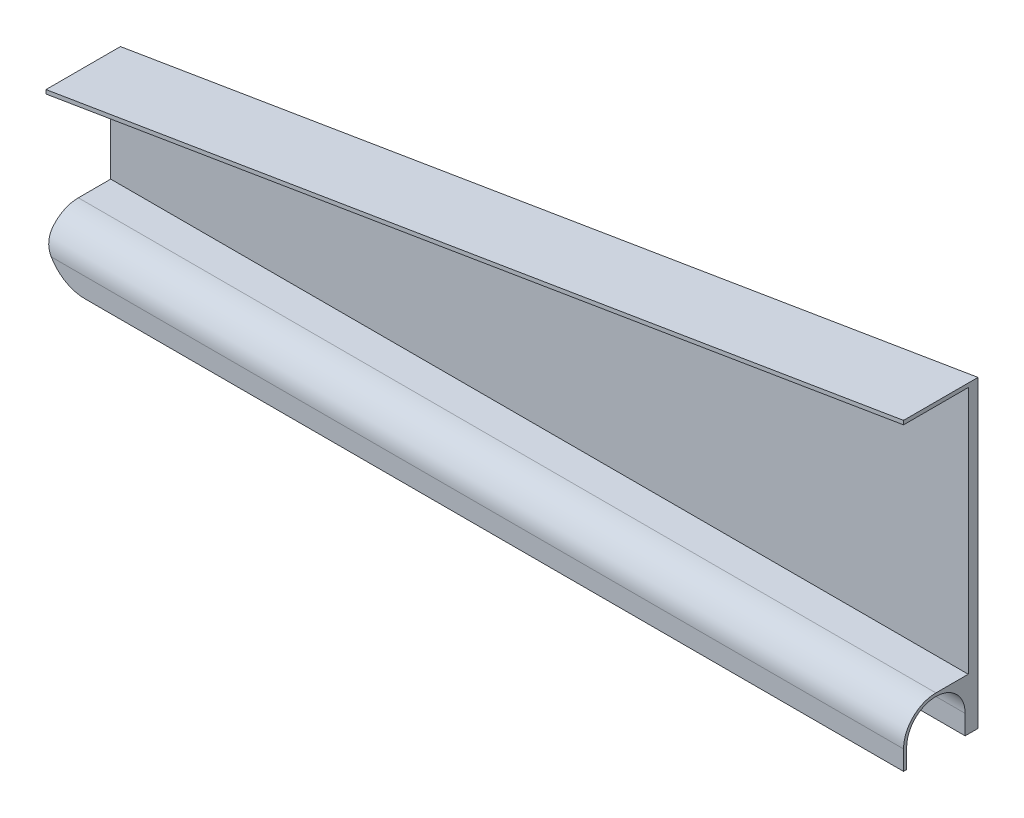
ISO-10303-21;
HEADER;
FILE_DESCRIPTION(('STEP AP214'),'2;1');
FILE_NAME('part.step','',(''),(''),'','','');
FILE_SCHEMA(('AUTOMOTIVE_DESIGN { 1 0 10303 214 1 1 1 1 }'));
ENDSEC;
DATA;
#1=APPLICATION_CONTEXT('core data for automotive mechanical design processes');
#2=APPLICATION_PROTOCOL_DEFINITION('international standard','automotive_design',2000,#1);
#3=PRODUCT_CONTEXT('',#1,'mechanical');
#4=PRODUCT('Part','Part','',(#3));
#5=PRODUCT_RELATED_PRODUCT_CATEGORY('part','',(#4));
#6=PRODUCT_DEFINITION_FORMATION('','',#4);
#7=PRODUCT_DEFINITION_CONTEXT('part definition',#1,'design');
#8=PRODUCT_DEFINITION('design','',#6,#7);
#9=PRODUCT_DEFINITION_SHAPE('','',#8);
#10=(LENGTH_UNIT() NAMED_UNIT(*) SI_UNIT(.MILLI.,.METRE.));
#11=(NAMED_UNIT(*) PLANE_ANGLE_UNIT() SI_UNIT($,.RADIAN.));
#12=(NAMED_UNIT(*) SI_UNIT($,.STERADIAN.) SOLID_ANGLE_UNIT());
#13=UNCERTAINTY_MEASURE_WITH_UNIT(LENGTH_MEASURE(1.E-05),#10,'distance_accuracy_value','');
#14=(GEOMETRIC_REPRESENTATION_CONTEXT(3) GLOBAL_UNCERTAINTY_ASSIGNED_CONTEXT((#13)) GLOBAL_UNIT_ASSIGNED_CONTEXT((#10,
#11,#12)) REPRESENTATION_CONTEXT('',''));
#15=CARTESIAN_POINT('',(0.,0.,0.));
#16=DIRECTION('',(0.,0.,1.));
#17=DIRECTION('',(1.,0.,0.));
#18=AXIS2_PLACEMENT_3D('',#15,#16,#17);
#19=CARTESIAN_POINT('',(-508.085110878234,0.,6.35));
#20=DIRECTION('',(-1.,0.,0.));
#21=DIRECTION('',(0.,0.,1.));
#22=AXIS2_PLACEMENT_3D('',#19,#20,#21);
#23=PLANE('',#22);
#24=DIRECTION('',(0.,0.,-1.));
#25=VECTOR('',#24,1.);
#26=CARTESIAN_POINT('',(-508.085110878234,-181.437945662038,6.35));
#27=LINE('',#26,#25);
#28=CARTESIAN_POINT('',(-508.085110878234,-181.437945662038,13.2329683428764));
#29=VERTEX_POINT('',#28);
#30=CARTESIAN_POINT('',(-508.085110878234,-181.437945662038,0.));
#31=VERTEX_POINT('',#30);
#32=EDGE_CURVE('E48',#29,#31,#27,.T.);
#33=ORIENTED_EDGE('',*,*,#32,.F.);
#34=CARTESIAN_POINT('',(-508.085110878234,-194.137945662038,27.432));
#35=DIRECTION('',(-1.,0.,0.));
#36=DIRECTION('',(0.,0.,1.));
#37=AXIS2_PLACEMENT_3D('',#34,#35,#36);
#38=CIRCLE('',#37,19.05);
#39=CARTESIAN_POINT('',(-508.085110878234,-181.437945662038,41.6310316571236));
#40=VERTEX_POINT('',#39);
#41=EDGE_CURVE('E157',#40,#29,#38,.T.);
#42=ORIENTED_EDGE('',*,*,#41,.F.);
#43=DIRECTION('',(0.,0.,-1.));
#44=VECTOR('',#43,1.);
#45=CARTESIAN_POINT('',(-508.085110878234,-181.437945662038,116.84));
#46=LINE('',#45,#44);
#47=CARTESIAN_POINT('',(-508.085110878234,-181.437945662038,44.2593801882527));
#48=VERTEX_POINT('',#47);
#49=EDGE_CURVE('E146',#48,#40,#46,.T.);
#50=ORIENTED_EDGE('',*,*,#49,.F.);
#51=CARTESIAN_POINT('',(-508.085110878234,-194.137945662038,27.432));
#52=DIRECTION('',(-1.,0.,0.));
#53=DIRECTION('',(0.,0.,1.));
#54=AXIS2_PLACEMENT_3D('',#51,#52,#53);
#55=CIRCLE('',#54,21.082);
#56=CARTESIAN_POINT('',(-508.085110878234,-173.055945662038,27.432));
#57=VERTEX_POINT('',#56);
#58=EDGE_CURVE('E154',#48,#57,#55,.T.);
#59=ORIENTED_EDGE('',*,*,#58,.T.);
#60=DIRECTION('',(0.,0.,1.));
#61=VECTOR('',#60,1.);
#62=CARTESIAN_POINT('',(-508.085110878234,-173.055945662038,0.));
#63=LINE('',#62,#61);
#64=CARTESIAN_POINT('',(-508.085110878234,-173.055945662038,6.35));
#65=VERTEX_POINT('',#64);
#66=EDGE_CURVE('E175',#65,#57,#63,.T.);
#67=ORIENTED_EDGE('',*,*,#66,.F.);
#68=DIRECTION('',(0.,1.,0.));
#69=VECTOR('',#68,1.);
#70=CARTESIAN_POINT('',(-508.085110878234,0.,6.35));
#71=LINE('',#70,#69);
#72=CARTESIAN_POINT('',(-508.085110878234,-103.967945662038,6.35));
#73=VERTEX_POINT('',#72);
#74=EDGE_CURVE('E196',#65,#73,#71,.T.);
#75=ORIENTED_EDGE('',*,*,#74,.T.);
#76=DIRECTION('',(0.,0.,-1.));
#77=VECTOR('',#76,1.);
#78=CARTESIAN_POINT('',(-508.085110878234,-103.967945662038,48.514));
#79=LINE('',#78,#77);
#80=CARTESIAN_POINT('',(-508.085110878234,-103.967945662038,48.514));
#81=VERTEX_POINT('',#80);
#82=EDGE_CURVE('E261',#81,#73,#79,.T.);
#83=ORIENTED_EDGE('',*,*,#82,.F.);
#84=DIRECTION('',(0.,-1.,0.));
#85=VECTOR('',#84,1.);
#86=CARTESIAN_POINT('',(-508.085110878234,-101.427945662038,48.514));
#87=LINE('',#86,#85);
#88=CARTESIAN_POINT('',(-508.085110878234,-101.427945662038,48.514));
#89=VERTEX_POINT('',#88);
#90=EDGE_CURVE('E237',#89,#81,#87,.T.);
#91=ORIENTED_EDGE('',*,*,#90,.F.);
#92=DIRECTION('',(0.,0.,1.));
#93=VECTOR('',#92,1.);
#94=CARTESIAN_POINT('',(-508.085110878234,-101.427945662038,0.));
#95=LINE('',#94,#93);
#96=CARTESIAN_POINT('',(-508.085110878234,-101.427945662038,0.));
#97=VERTEX_POINT('',#96);
#98=EDGE_CURVE('E220',#97,#89,#95,.T.);
#99=ORIENTED_EDGE('',*,*,#98,.F.);
#100=DIRECTION('',(0.,1.,0.));
#101=VECTOR('',#100,1.);
#102=CARTESIAN_POINT('',(-508.085110878234,0.,0.));
#103=LINE('',#102,#101);
#104=EDGE_CURVE('E164',#31,#97,#103,.T.);
#105=ORIENTED_EDGE('',*,*,#104,.F.);
#106=EDGE_LOOP('',(#33,#42,#50,#59,#67,#75,#83,#91,#99,#105));
#107=FACE_BOUND('',#106,.T.);
#108=ADVANCED_FACE('F35',(#107),#23,.T.);
#109=CARTESIAN_POINT('',(0.,-206.837945662038,6.35));
#110=DIRECTION('',(0.,1.,0.));
#111=DIRECTION('',(-1.,0.,0.));
#112=AXIS2_PLACEMENT_3D('',#109,#110,#111);
#113=PLANE('',#112);
#114=DIRECTION('',(1.,0.,0.));
#115=VECTOR('',#114,1.);
#116=CARTESIAN_POINT('',(-562.11312601853,-206.837945662038,8.38199999999999));
#117=LINE('',#116,#115);
#118=CARTESIAN_POINT('',(-482.685110878234,-206.837945662038,8.38199999999999));
#119=VERTEX_POINT('',#118);
#120=CARTESIAN_POINT('',(50.7148891217656,-206.837945662038,8.38199999999999));
#121=VERTEX_POINT('',#120);
#122=EDGE_CURVE('E180',#119,#121,#117,.T.);
#123=ORIENTED_EDGE('',*,*,#122,.F.);
#124=DIRECTION('',(0.,0.,-1.));
#125=VECTOR('',#124,1.);
#126=CARTESIAN_POINT('',(-482.685110878234,-206.837945662038,6.35));
#127=LINE('',#126,#125);
#128=CARTESIAN_POINT('',(-482.685110878234,-206.837945662038,0.));
#129=VERTEX_POINT('',#128);
#130=EDGE_CURVE('E213',#119,#129,#127,.T.);
#131=ORIENTED_EDGE('',*,*,#130,.T.);
#132=DIRECTION('',(1.,0.,0.));
#133=VECTOR('',#132,1.);
#134=CARTESIAN_POINT('',(0.,-206.837945662038,0.));
#135=LINE('',#134,#133);
#136=CARTESIAN_POINT('',(50.7148891217656,-206.837945662038,0.));
#137=VERTEX_POINT('',#136);
#138=EDGE_CURVE('E205',#129,#137,#135,.T.);
#139=ORIENTED_EDGE('',*,*,#138,.T.);
#140=DIRECTION('',(0.,0.,-1.));
#141=VECTOR('',#140,1.);
#142=CARTESIAN_POINT('',(50.7148891217656,-206.837945662038,6.35));
#143=LINE('',#142,#141);
#144=EDGE_CURVE('E211',#121,#137,#143,.T.);
#145=ORIENTED_EDGE('',*,*,#144,.F.);
#146=EDGE_LOOP('',(#123,#131,#139,#145));
#147=FACE_BOUND('',#146,.T.);
#148=ADVANCED_FACE('F229',(#147),#113,.F.);
#149=CARTESIAN_POINT('',(0.,0.,6.35));
#150=DIRECTION('',(0.,0.,1.));
#151=DIRECTION('',(1.,0.,0.));
#152=AXIS2_PLACEMENT_3D('',#149,#150,#151);
#153=PLANE('',#152);
#154=DIRECTION('',(0.,-1.,0.));
#155=VECTOR('',#154,1.);
#156=CARTESIAN_POINT('',(50.7148891217656,0.,6.35));
#157=LINE('',#156,#155);
#158=CARTESIAN_POINT('',(50.7148891217656,-11.2579456620378,6.35));
#159=VERTEX_POINT('',#158);
#160=CARTESIAN_POINT('',(50.7148891217656,-173.055945662038,6.35));
#161=VERTEX_POINT('',#160);
#162=EDGE_CURVE('E199',#159,#161,#157,.T.);
#163=ORIENTED_EDGE('',*,*,#162,.F.);
#164=DIRECTION('',(0.986514849274291,0.163671781811416,0.));
#165=VECTOR('',#164,1.);
#166=CARTESIAN_POINT('',(-508.085110878234,-103.967945662038,6.35));
#167=LINE('',#166,#165);
#168=EDGE_CURVE('E235',#73,#159,#167,.T.);
#169=ORIENTED_EDGE('',*,*,#168,.F.);
#170=ORIENTED_EDGE('',*,*,#74,.F.);
#171=DIRECTION('',(1.,0.,0.));
#172=VECTOR('',#171,1.);
#173=CARTESIAN_POINT('',(-562.11312601853,-173.055945662038,6.35));
#174=LINE('',#173,#172);
#175=EDGE_CURVE('E177',#65,#161,#174,.T.);
#176=ORIENTED_EDGE('',*,*,#175,.T.);
#177=EDGE_LOOP('',(#163,#169,#170,#176));
#178=FACE_BOUND('',#177,.T.);
#179=ADVANCED_FACE('F328',(#178),#153,.T.);
#180=CARTESIAN_POINT('',(-482.685110878234,-181.437945662038,6.35));
#181=DIRECTION('',(0.,0.,-1.));
#182=DIRECTION('',(-1.,0.,0.));
#183=AXIS2_PLACEMENT_3D('',#180,#181,#182);
#184=CYLINDRICAL_SURFACE('',#183,25.4);
#185=CARTESIAN_POINT('',(-482.685110878234,-181.437945662038,0.));
#186=DIRECTION('',(0.,0.,1.));
#187=DIRECTION('',(1.,0.,0.));
#188=AXIS2_PLACEMENT_3D('',#185,#186,#187);
#189=CIRCLE('',#188,25.4);
#190=EDGE_CURVE('E168',#129,#31,#189,.F.);
#191=ORIENTED_EDGE('',*,*,#190,.F.);
#192=ORIENTED_EDGE('',*,*,#130,.F.);
#193=CARTESIAN_POINT('',(-482.685110878234,-181.437945662038,8.38199999999997));
#194=DIRECTION('',(0.,0.,-1.));
#195=DIRECTION('',(0.,1.,0.));
#196=AXIS2_PLACEMENT_3D('',#193,#194,#195);
#197=CIRCLE('',#196,25.4);
#198=CARTESIAN_POINT('',(-504.682156134359,-194.137945662038,8.38199999999999));
#199=VERTEX_POINT('',#198);
#200=EDGE_CURVE('E55',#199,#119,#197,.F.);
#201=ORIENTED_EDGE('',*,*,#200,.F.);
#202=CARTESIAN_POINT('',(-504.682156134359,-194.137945662038,8.38199999999999));
#203=CARTESIAN_POINT('',(-504.79720975601,-193.938670363744,8.38199960905063));
#204=CARTESIAN_POINT('',(-504.909542266543,-193.737845939561,8.38512760889851));
#205=CARTESIAN_POINT('',(-505.128637186274,-193.333366321374,8.39792245076879));
#206=CARTESIAN_POINT('',(-505.235399127924,-193.129710891571,8.40758984070479));
#207=CARTESIAN_POINT('',(-505.54716362878,-192.514842149194,8.44683038355515));
#208=CARTESIAN_POINT('',(-505.743584211063,-192.099831482841,8.48664220709793));
#209=CARTESIAN_POINT('',(-506.112042738039,-191.263790426877,8.59535665893664));
#210=CARTESIAN_POINT('',(-506.284124434883,-190.842772376236,8.66420617751531));
#211=CARTESIAN_POINT('',(-506.603660878553,-189.997560315258,8.83239535956349));
#212=CARTESIAN_POINT('',(-506.751120951007,-189.573367012519,8.93172841625499));
#213=CARTESIAN_POINT('',(-507.021774223212,-188.723977190887,9.16219407467895));
#214=CARTESIAN_POINT('',(-507.144873455938,-188.29878295229,9.29344561996288));
#215=CARTESIAN_POINT('',(-507.366489919966,-187.452985054512,9.58783164899344));
#216=CARTESIAN_POINT('',(-507.465003849174,-187.03238201923,9.75097041032528));
#217=CARTESIAN_POINT('',(-507.638319030903,-186.200084642028,10.1086673678386));
#218=CARTESIAN_POINT('',(-507.713136225676,-185.788384485069,10.3032043069566));
#219=CARTESIAN_POINT('',(-507.840627117345,-184.977510247968,10.7227990128837));
#220=CARTESIAN_POINT('',(-507.893306564792,-184.578332939824,10.9478488334835));
#221=CARTESIAN_POINT('',(-507.988863951516,-183.700528957711,11.4855929629348));
#222=CARTESIAN_POINT('',(-508.026251273516,-183.226161227395,11.8062970308383));
#223=CARTESIAN_POINT('',(-508.062339033711,-182.537588191789,12.318557161645));
#224=CARTESIAN_POINT('',(-508.071036658041,-182.311989671166,12.4944253237479));
#225=CARTESIAN_POINT('',(-508.082422361592,-181.868820448773,12.8562376613549));
#226=CARTESIAN_POINT('',(-508.085109770817,-181.651250644672,13.0421829578547));
#227=CARTESIAN_POINT('',(-508.085110878234,-181.437945662038,13.2329683428764));
#228=B_SPLINE_CURVE_WITH_KNOTS('',3,(#202,#203,#204,#205,#206,#207,#208,#209,#210,#211,#212,
#213,#214,#215,#216,#217,#218,#219,#220,#221,#222,#223,#224,#225,#226,#227),.UNSPECIFIED.,.F.,
.F.,(4,2,2,2,2,2,2,2,2,2,2,2,4),(0.,0.690227917147268,1.38051367334319,2.76144818206338,
4.13986785108374,5.51798898229213,6.90132653906519,8.28484979441021,9.66744028159059,
11.0496714016422,12.7677137040457,13.6259651289362,14.4843122237777),.UNSPECIFIED.);
#229=EDGE_CURVE('E217',#199,#29,#228,.T.);
#230=ORIENTED_EDGE('',*,*,#229,.T.);
#231=ORIENTED_EDGE('',*,*,#32,.T.);
#232=EDGE_LOOP('',(#191,#192,#201,#230,#231));
#233=FACE_BOUND('',#232,.T.);
#234=ADVANCED_FACE('F216',(#233),#184,.T.);
#235=CARTESIAN_POINT('',(50.7148891217656,0.,6.35));
#236=DIRECTION('',(1.,0.,0.));
#237=DIRECTION('',(0.,1.,0.));
#238=AXIS2_PLACEMENT_3D('',#235,#236,#237);
#239=PLANE('',#238);
#240=DIRECTION('',(0.,-1.,0.));
#241=VECTOR('',#240,1.);
#242=CARTESIAN_POINT('',(50.7148891217656,0.,0.));
#243=LINE('',#242,#241);
#244=CARTESIAN_POINT('',(50.7148891217656,-8.71794566203782,0.));
#245=VERTEX_POINT('',#244);
#246=EDGE_CURVE('E200',#245,#137,#243,.T.);
#247=ORIENTED_EDGE('',*,*,#246,.F.);
#248=DIRECTION('',(0.,0.,-1.));
#249=VECTOR('',#248,1.);
#250=CARTESIAN_POINT('',(50.7148891217656,-8.71794566203782,6.35));
#251=LINE('',#250,#249);
#252=CARTESIAN_POINT('',(50.7148891217656,-8.71794566203782,48.514));
#253=VERTEX_POINT('',#252);
#254=EDGE_CURVE('E201',#253,#245,#251,.T.);
#255=ORIENTED_EDGE('',*,*,#254,.F.);
#256=DIRECTION('',(0.,1.,0.));
#257=VECTOR('',#256,1.);
#258=CARTESIAN_POINT('',(50.7148891217656,-8.71794566203782,48.514));
#259=LINE('',#258,#257);
#260=CARTESIAN_POINT('',(50.7148891217656,-11.2579456620378,48.514));
#261=VERTEX_POINT('',#260);
#262=EDGE_CURVE('E252',#261,#253,#259,.T.);
#263=ORIENTED_EDGE('',*,*,#262,.F.);
#264=DIRECTION('',(0.,0.,-1.));
#265=VECTOR('',#264,1.);
#266=CARTESIAN_POINT('',(50.7148891217656,-11.2579456620378,48.514));
#267=LINE('',#266,#265);
#268=EDGE_CURVE('E257',#261,#159,#267,.T.);
#269=ORIENTED_EDGE('',*,*,#268,.T.);
#270=ORIENTED_EDGE('',*,*,#162,.T.);
#271=DIRECTION('',(0.,0.,1.));
#272=VECTOR('',#271,1.);
#273=CARTESIAN_POINT('',(50.7148891217656,-173.055945662038,0.));
#274=LINE('',#273,#272);
#275=CARTESIAN_POINT('',(50.7148891217656,-173.055945662038,27.432));
#276=VERTEX_POINT('',#275);
#277=EDGE_CURVE('E272',#161,#276,#274,.T.);
#278=ORIENTED_EDGE('',*,*,#277,.T.);
#279=CARTESIAN_POINT('',(50.7148891217656,-194.137945662038,27.432));
#280=DIRECTION('',(1.,0.,0.));
#281=DIRECTION('',(0.,0.,-1.));
#282=AXIS2_PLACEMENT_3D('',#279,#280,#281);
#283=CIRCLE('',#282,21.082);
#284=CARTESIAN_POINT('',(50.7148891217656,-194.137945662038,48.514));
#285=VERTEX_POINT('',#284);
#286=EDGE_CURVE('E194',#285,#276,#283,.F.);
#287=ORIENTED_EDGE('',*,*,#286,.F.);
#288=DIRECTION('',(0.,1.,0.));
#289=VECTOR('',#288,1.);
#290=CARTESIAN_POINT('',(50.7148891217656,0.,48.514));
#291=LINE('',#290,#289);
#292=CARTESIAN_POINT('',(50.7148891217656,-206.837945662038,48.514));
#293=VERTEX_POINT('',#292);
#294=EDGE_CURVE('E191',#293,#285,#291,.T.);
#295=ORIENTED_EDGE('',*,*,#294,.F.);
#296=DIRECTION('',(0.,0.,-1.));
#297=VECTOR('',#296,1.);
#298=CARTESIAN_POINT('',(50.7148891217656,-206.837945662038,0.));
#299=LINE('',#298,#297);
#300=CARTESIAN_POINT('',(50.7148891217656,-206.837945662038,46.482));
#301=VERTEX_POINT('',#300);
#302=EDGE_CURVE('E269',#293,#301,#299,.T.);
#303=ORIENTED_EDGE('',*,*,#302,.T.);
#304=DIRECTION('',(0.,1.,0.));
#305=VECTOR('',#304,1.);
#306=CARTESIAN_POINT('',(50.7148891217656,0.,46.4820000000001));
#307=LINE('',#306,#305);
#308=CARTESIAN_POINT('',(50.7148891217656,-194.137945662038,46.482));
#309=VERTEX_POINT('',#308);
#310=EDGE_CURVE('E171',#301,#309,#307,.T.);
#311=ORIENTED_EDGE('',*,*,#310,.T.);
#312=CARTESIAN_POINT('',(50.7148891217656,-194.137945662038,27.432));
#313=DIRECTION('',(1.,0.,0.));
#314=DIRECTION('',(0.,0.,-1.));
#315=AXIS2_PLACEMENT_3D('',#312,#313,#314);
#316=CIRCLE('',#315,19.05);
#317=CARTESIAN_POINT('',(50.7148891217656,-194.137945662038,8.38199999999999));
#318=VERTEX_POINT('',#317);
#319=EDGE_CURVE('E165',#309,#318,#316,.F.);
#320=ORIENTED_EDGE('',*,*,#319,.T.);
#321=DIRECTION('',(0.,1.,0.));
#322=VECTOR('',#321,1.);
#323=CARTESIAN_POINT('',(50.7148891217656,0.,8.38199999999988));
#324=LINE('',#323,#322);
#325=EDGE_CURVE('E182',#121,#318,#324,.T.);
#326=ORIENTED_EDGE('',*,*,#325,.F.);
#327=ORIENTED_EDGE('',*,*,#144,.T.);
#328=EDGE_LOOP('',(#247,#255,#263,#269,#270,#278,#287,#295,#303,#311,#320,#326,#327));
#329=FACE_BOUND('',#328,.T.);
#330=ADVANCED_FACE('F336',(#329),#239,.T.);
#331=CARTESIAN_POINT('',(0.,0.,0.));
#332=DIRECTION('',(0.,0.,1.));
#333=DIRECTION('',(1.,0.,0.));
#334=AXIS2_PLACEMENT_3D('',#331,#332,#333);
#335=PLANE('',#334);
#336=ORIENTED_EDGE('',*,*,#104,.T.);
#337=DIRECTION('',(0.986514849274291,0.163671781811416,0.));
#338=VECTOR('',#337,1.);
#339=CARTESIAN_POINT('',(-508.085110878234,-101.427945662038,0.));
#340=LINE('',#339,#338);
#341=EDGE_CURVE('E263',#97,#245,#340,.T.);
#342=ORIENTED_EDGE('',*,*,#341,.T.);
#343=ORIENTED_EDGE('',*,*,#246,.T.);
#344=ORIENTED_EDGE('',*,*,#138,.F.);
#345=ORIENTED_EDGE('',*,*,#190,.T.);
#346=EDGE_LOOP('',(#336,#342,#343,#344,#345));
#347=FACE_BOUND('',#346,.T.);
#348=ADVANCED_FACE('F224',(#347),#335,.F.);
#349=CARTESIAN_POINT('',(-562.11312601853,-173.055945662038,0.));
#350=DIRECTION('',(0.,1.,0.));
#351=DIRECTION('',(0.,0.,1.));
#352=AXIS2_PLACEMENT_3D('',#349,#350,#351);
#353=PLANE('',#352);
#354=ORIENTED_EDGE('',*,*,#175,.F.);
#355=ORIENTED_EDGE('',*,*,#66,.T.);
#356=DIRECTION('',(1.,0.,0.));
#357=VECTOR('',#356,1.);
#358=CARTESIAN_POINT('',(-562.11312601853,-173.055945662038,27.432));
#359=LINE('',#358,#357);
#360=EDGE_CURVE('E162',#57,#276,#359,.T.);
#361=ORIENTED_EDGE('',*,*,#360,.T.);
#362=ORIENTED_EDGE('',*,*,#277,.F.);
#363=EDGE_LOOP('',(#354,#355,#361,#362));
#364=FACE_BOUND('',#363,.T.);
#365=ADVANCED_FACE('F346',(#364),#353,.T.);
#366=CARTESIAN_POINT('',(-562.11312601853,0.,8.38199999999988));
#367=DIRECTION('',(0.,0.,-1.));
#368=DIRECTION('',(0.,1.,0.));
#369=AXIS2_PLACEMENT_3D('',#366,#367,#368);
#370=PLANE('',#369);
#371=DIRECTION('',(1.,0.,0.));
#372=VECTOR('',#371,1.);
#373=CARTESIAN_POINT('',(-562.11312601853,-194.137945662038,8.38199999999999));
#374=LINE('',#373,#372);
#375=EDGE_CURVE('E183',#199,#318,#374,.T.);
#376=ORIENTED_EDGE('',*,*,#375,.F.);
#377=ORIENTED_EDGE('',*,*,#200,.T.);
#378=ORIENTED_EDGE('',*,*,#122,.T.);
#379=ORIENTED_EDGE('',*,*,#325,.T.);
#380=EDGE_LOOP('',(#376,#377,#378,#379));
#381=FACE_BOUND('',#380,.T.);
#382=ADVANCED_FACE('F233',(#381),#370,.F.);
#383=CARTESIAN_POINT('',(-562.11312601853,-194.137945662038,27.432));
#384=DIRECTION('',(1.,0.,0.));
#385=DIRECTION('',(0.,0.,-1.));
#386=AXIS2_PLACEMENT_3D('',#383,#384,#385);
#387=CYLINDRICAL_SURFACE('',#386,19.05);
#388=ORIENTED_EDGE('',*,*,#229,.F.);
#389=ORIENTED_EDGE('',*,*,#375,.T.);
#390=ORIENTED_EDGE('',*,*,#319,.F.);
#391=DIRECTION('',(1.,0.,0.));
#392=VECTOR('',#391,1.);
#393=CARTESIAN_POINT('',(-562.11312601853,-194.137945662038,46.482));
#394=LINE('',#393,#392);
#395=CARTESIAN_POINT('',(-504.682156134359,-194.137945662038,46.482));
#396=VERTEX_POINT('',#395);
#397=EDGE_CURVE('E185',#396,#309,#394,.T.);
#398=ORIENTED_EDGE('',*,*,#397,.F.);
#399=CARTESIAN_POINT('',(-508.085110878234,-181.437945662038,41.6310316571236));
#400=CARTESIAN_POINT('',(-508.085110853028,-181.60945252099,41.7844328099501));
#401=CARTESIAN_POINT('',(-508.083373348191,-181.783723997483,41.9347107388957));
#402=CARTESIAN_POINT('',(-508.076090964915,-182.137557457659,42.2288281334745));
#403=CARTESIAN_POINT('',(-508.070545855066,-182.317119762261,42.3726672072151));
#404=CARTESIAN_POINT('',(-508.047697829708,-182.863422146816,42.7942640423852));
#405=CARTESIAN_POINT('',(-508.024181965592,-183.237712354122,43.0620429883658));
#406=CARTESIAN_POINT('',(-507.958184168992,-184.002905967128,43.5687209328664));
#407=CARTESIAN_POINT('',(-507.915731173468,-184.393783205462,43.8076632901387));
#408=CARTESIAN_POINT('',(-507.809738556414,-185.189492229823,44.2556757282683));
#409=CARTESIAN_POINT('',(-507.746202856225,-185.594321408278,44.4647513539433));
#410=CARTESIAN_POINT('',(-507.596050115694,-186.415906139081,44.8526691516433));
#411=CARTESIAN_POINT('',(-507.509350866137,-186.832699355812,45.0313998580509));
#412=CARTESIAN_POINT('',(-507.31174018432,-187.67296092858,45.3571091057461));
#413=CARTESIAN_POINT('',(-507.200825966186,-188.096430047457,45.5040839897298));
#414=CARTESIAN_POINT('',(-506.954221881208,-188.945644371535,45.7661154534158));
#415=CARTESIAN_POINT('',(-506.818551018047,-189.371387589415,45.8811963460616));
#416=CARTESIAN_POINT('',(-506.522369820378,-190.221322496853,46.0801399942699));
#417=CARTESIAN_POINT('',(-506.361865963714,-190.645514561583,46.16401087179));
#418=CARTESIAN_POINT('',(-505.97435007336,-191.591354382813,46.3184801878725));
#419=CARTESIAN_POINT('',(-505.740653370124,-192.111643085528,46.3809045766854));
#420=CARTESIAN_POINT('',(-505.36334297739,-192.880826831807,46.4422190001803));
#421=CARTESIAN_POINT('',(-505.233166744518,-193.135251560675,46.4572705288326));
#422=CARTESIAN_POINT('',(-504.964118338946,-193.639894845376,46.4771611036847));
#423=CARTESIAN_POINT('',(-504.825245525546,-193.890113089577,46.4819993965328));
#424=CARTESIAN_POINT('',(-504.682156134359,-194.137945662038,46.482));
#425=B_SPLINE_CURVE_WITH_KNOTS('',3,(#399,#400,#401,#402,#403,#404,#405,#406,#407,#408,#409,
#410,#411,#412,#413,#414,#415,#416,#417,#418,#419,#420,#421,#422,#423,#424),.UNSPECIFIED.,.F.,
.F.,(4,2,2,2,2,2,2,2,2,2,2,2,4),(0.,0.69021297965438,1.38046791125707,2.7612399817614,
4.13990934730637,5.5183224265845,6.90169412584389,8.28522506257534,9.66769840772432,
11.0498117320456,12.7676853661981,13.6259672320179,14.4843124044433),.UNSPECIFIED.);
#426=EDGE_CURVE('E239',#40,#396,#425,.T.);
#427=ORIENTED_EDGE('',*,*,#426,.F.);
#428=ORIENTED_EDGE('',*,*,#41,.T.);
#429=EDGE_LOOP('',(#388,#389,#390,#398,#427,#428));
#430=FACE_BOUND('',#429,.T.);
#431=ADVANCED_FACE('F278',(#430),#387,.F.);
#432=CARTESIAN_POINT('',(-562.11312601853,0.,46.4820000000001));
#433=DIRECTION('',(0.,0.,-1.));
#434=DIRECTION('',(0.,1.,0.));
#435=AXIS2_PLACEMENT_3D('',#432,#433,#434);
#436=PLANE('',#435);
#437=CARTESIAN_POINT('',(-482.685110878234,-181.437945662038,46.482));
#438=DIRECTION('',(0.,0.,-1.));
#439=DIRECTION('',(0.,1.,0.));
#440=AXIS2_PLACEMENT_3D('',#437,#438,#439);
#441=CIRCLE('',#440,25.4);
#442=CARTESIAN_POINT('',(-482.685110878234,-206.837945662038,46.482));
#443=VERTEX_POINT('',#442);
#444=EDGE_CURVE('E282',#396,#443,#441,.F.);
#445=ORIENTED_EDGE('',*,*,#444,.F.);
#446=ORIENTED_EDGE('',*,*,#397,.T.);
#447=ORIENTED_EDGE('',*,*,#310,.F.);
#448=DIRECTION('',(1.,0.,0.));
#449=VECTOR('',#448,1.);
#450=CARTESIAN_POINT('',(-562.11312601853,-206.837945662038,46.482));
#451=LINE('',#450,#449);
#452=EDGE_CURVE('E187',#443,#301,#451,.T.);
#453=ORIENTED_EDGE('',*,*,#452,.F.);
#454=EDGE_LOOP('',(#445,#446,#447,#453));
#455=FACE_BOUND('',#454,.T.);
#456=ADVANCED_FACE('F317',(#455),#436,.T.);
#457=CARTESIAN_POINT('',(-562.11312601853,-206.837945662038,0.));
#458=DIRECTION('',(0.,-1.,0.));
#459=DIRECTION('',(0.,0.,-1.));
#460=AXIS2_PLACEMENT_3D('',#457,#458,#459);
#461=PLANE('',#460);
#462=DIRECTION('',(0.,0.,-1.));
#463=VECTOR('',#462,1.);
#464=CARTESIAN_POINT('',(-482.685110878234,-206.837945662038,116.84));
#465=LINE('',#464,#463);
#466=CARTESIAN_POINT('',(-482.685110878234,-206.837945662038,48.514));
#467=VERTEX_POINT('',#466);
#468=EDGE_CURVE('E158',#467,#443,#465,.T.);
#469=ORIENTED_EDGE('',*,*,#468,.T.);
#470=ORIENTED_EDGE('',*,*,#452,.T.);
#471=ORIENTED_EDGE('',*,*,#302,.F.);
#472=DIRECTION('',(1.,0.,0.));
#473=VECTOR('',#472,1.);
#474=CARTESIAN_POINT('',(-562.11312601853,-206.837945662038,48.514));
#475=LINE('',#474,#473);
#476=EDGE_CURVE('E189',#467,#293,#475,.T.);
#477=ORIENTED_EDGE('',*,*,#476,.F.);
#478=EDGE_LOOP('',(#469,#470,#471,#477));
#479=FACE_BOUND('',#478,.T.);
#480=ADVANCED_FACE('F314',(#479),#461,.T.);
#481=CARTESIAN_POINT('',(-562.11312601853,0.,48.514));
#482=DIRECTION('',(0.,0.,-1.));
#483=DIRECTION('',(-1.,0.,0.));
#484=AXIS2_PLACEMENT_3D('',#481,#482,#483);
#485=PLANE('',#484);
#486=DIRECTION('',(1.,0.,0.));
#487=VECTOR('',#486,1.);
#488=CARTESIAN_POINT('',(-562.11312601853,-194.137945662038,48.514));
#489=LINE('',#488,#487);
#490=CARTESIAN_POINT('',(-504.682156134359,-194.137945662038,48.514));
#491=VERTEX_POINT('',#490);
#492=EDGE_CURVE('E192',#491,#285,#489,.T.);
#493=ORIENTED_EDGE('',*,*,#492,.F.);
#494=CARTESIAN_POINT('',(-482.685110878234,-181.437945662038,48.514));
#495=DIRECTION('',(0.,0.,-1.));
#496=DIRECTION('',(-1.,0.,0.));
#497=AXIS2_PLACEMENT_3D('',#494,#495,#496);
#498=CIRCLE('',#497,25.4);
#499=EDGE_CURVE('E63',#491,#467,#498,.F.);
#500=ORIENTED_EDGE('',*,*,#499,.T.);
#501=ORIENTED_EDGE('',*,*,#476,.T.);
#502=ORIENTED_EDGE('',*,*,#294,.T.);
#503=EDGE_LOOP('',(#493,#500,#501,#502));
#504=FACE_BOUND('',#503,.T.);
#505=ADVANCED_FACE('F311',(#504),#485,.F.);
#506=CARTESIAN_POINT('',(-562.11312601853,-194.137945662038,27.432));
#507=DIRECTION('',(1.,0.,0.));
#508=DIRECTION('',(0.,0.,-1.));
#509=AXIS2_PLACEMENT_3D('',#506,#507,#508);
#510=CYLINDRICAL_SURFACE('',#509,21.082);
#511=ORIENTED_EDGE('',*,*,#58,.F.);
#512=CARTESIAN_POINT('',(-508.085110878234,-181.437945662038,44.2593801882527));
#513=CARTESIAN_POINT('',(-508.085111287121,-181.632534087238,44.4062416071743));
#514=CARTESIAN_POINT('',(-508.082874157615,-181.829653891055,44.5497120955761));
#515=CARTESIAN_POINT('',(-508.07358409758,-182.228685021162,44.8296910047859));
#516=CARTESIAN_POINT('',(-508.066530842612,-182.430596669373,44.9661989558952));
#517=CARTESIAN_POINT('',(-508.037632364961,-183.043152876425,45.3650319052063));
#518=CARTESIAN_POINT('',(-508.008048161098,-183.460541956862,45.6166080996458));
#519=CARTESIAN_POINT('',(-507.925870456253,-184.309484627351,46.0891129165484));
#520=CARTESIAN_POINT('',(-507.873303101312,-184.741021607986,46.3100759899847));
#521=CARTESIAN_POINT('',(-507.743172038085,-185.615111762006,46.7204691890038));
#522=CARTESIAN_POINT('',(-507.665613385298,-186.057662690683,46.9099056803673));
#523=CARTESIAN_POINT('',(-507.483710539201,-186.951391491008,47.2571041563406));
#524=CARTESIAN_POINT('',(-507.379278429399,-187.402593092205,47.4147590898683));
#525=CARTESIAN_POINT('',(-507.142838725814,-188.308062690582,47.6974427556528));
#526=CARTESIAN_POINT('',(-507.010826975798,-188.762331139938,47.8224665640275));
#527=CARTESIAN_POINT('',(-506.719156555622,-189.669055721659,48.0401752203894));
#528=CARTESIAN_POINT('',(-506.559532825654,-190.121513413846,48.132900497362));
#529=CARTESIAN_POINT('',(-506.212907553535,-191.021005121092,48.2873010695775));
#530=CARTESIAN_POINT('',(-506.025916119327,-191.468041072879,48.3489877913805));
#531=CARTESIAN_POINT('',(-505.653922255688,-192.290001072444,48.4363189836869));
#532=CARTESIAN_POINT('',(-505.472436829326,-192.66611984041,48.4658480508726));
#533=CARTESIAN_POINT('',(-505.090992917914,-193.409210057536,48.5046885524433));
#534=CARTESIAN_POINT('',(-504.891063616507,-193.776194829358,48.5140313741431));
#535=CARTESIAN_POINT('',(-504.682156134359,-194.137945662038,48.514));
#536=B_SPLINE_CURVE_WITH_KNOTS('',3,(#512,#513,#514,#515,#516,#517,#518,#519,#520,#521,#522,
#523,#524,#525,#526,#527,#528,#529,#530,#531,#532,#533,#534,#535),.UNSPECIFIED.,.F.,.F.,(4,2,2,
2,2,2,2,2,2,2,2,4),(0.,0.731271085460374,1.46259143802344,2.92551969856274,4.3867880187269,
5.84776092375242,7.31357554898584,8.77961123098987,10.2438051839465,11.7074597121903,
12.9624481638725,14.2154838428105),.UNSPECIFIED.);
#537=EDGE_CURVE('E11',#48,#491,#536,.T.);
#538=ORIENTED_EDGE('',*,*,#537,.T.);
#539=ORIENTED_EDGE('',*,*,#492,.T.);
#540=ORIENTED_EDGE('',*,*,#286,.T.);
#541=ORIENTED_EDGE('',*,*,#360,.F.);
#542=EDGE_LOOP('',(#511,#538,#539,#540,#541));
#543=FACE_BOUND('',#542,.T.);
#544=ADVANCED_FACE('F160',(#543),#510,.T.);
#545=CARTESIAN_POINT('',(-508.085110878234,-101.427945662038,0.));
#546=DIRECTION('',(0.163671781811416,-0.98651484927429,0.));
#547=DIRECTION('',(0.986514849274291,0.163671781811416,0.));
#548=AXIS2_PLACEMENT_3D('',#545,#546,#547);
#549=PLANE('',#548);
#550=ORIENTED_EDGE('',*,*,#98,.T.);
#551=DIRECTION('',(-0.986514849274291,-0.163671781811416,0.));
#552=VECTOR('',#551,1.);
#553=CARTESIAN_POINT('',(-508.085110878234,-101.427945662038,48.514));
#554=LINE('',#553,#552);
#555=EDGE_CURVE('E255',#253,#89,#554,.T.);
#556=ORIENTED_EDGE('',*,*,#555,.F.);
#557=ORIENTED_EDGE('',*,*,#254,.T.);
#558=ORIENTED_EDGE('',*,*,#341,.F.);
#559=EDGE_LOOP('',(#550,#556,#557,#558));
#560=FACE_BOUND('',#559,.T.);
#561=ADVANCED_FACE('F304',(#560),#549,.F.);
#562=CARTESIAN_POINT('',(-508.085110878234,-103.967945662038,48.514));
#563=DIRECTION('',(-0.163671781811416,0.986514849274291,0.));
#564=DIRECTION('',(-0.986514849274291,-0.163671781811416,0.));
#565=AXIS2_PLACEMENT_3D('',#562,#563,#564);
#566=PLANE('',#565);
#567=ORIENTED_EDGE('',*,*,#168,.T.);
#568=ORIENTED_EDGE('',*,*,#268,.F.);
#569=DIRECTION('',(0.986514849274291,0.163671781811416,0.));
#570=VECTOR('',#569,1.);
#571=CARTESIAN_POINT('',(-508.085110878234,-103.967945662038,48.514));
#572=LINE('',#571,#570);
#573=EDGE_CURVE('E250',#81,#261,#572,.T.);
#574=ORIENTED_EDGE('',*,*,#573,.F.);
#575=ORIENTED_EDGE('',*,*,#82,.T.);
#576=EDGE_LOOP('',(#567,#568,#574,#575));
#577=FACE_BOUND('',#576,.T.);
#578=ADVANCED_FACE('F300',(#577),#566,.F.);
#579=CARTESIAN_POINT('',(0.,0.,48.514));
#580=DIRECTION('',(0.,0.,1.));
#581=DIRECTION('',(1.,0.,0.));
#582=AXIS2_PLACEMENT_3D('',#579,#580,#581);
#583=PLANE('',#582);
#584=ORIENTED_EDGE('',*,*,#90,.T.);
#585=ORIENTED_EDGE('',*,*,#573,.T.);
#586=ORIENTED_EDGE('',*,*,#262,.T.);
#587=ORIENTED_EDGE('',*,*,#555,.T.);
#588=EDGE_LOOP('',(#584,#585,#586,#587));
#589=FACE_BOUND('',#588,.T.);
#590=ADVANCED_FACE('F295',(#589),#583,.T.);
#591=CARTESIAN_POINT('',(-482.685110878234,-181.437945662038,116.84));
#592=DIRECTION('',(0.,0.,-1.));
#593=DIRECTION('',(-1.,0.,0.));
#594=AXIS2_PLACEMENT_3D('',#591,#592,#593);
#595=CYLINDRICAL_SURFACE('',#594,25.4);
#596=ORIENTED_EDGE('',*,*,#426,.T.);
#597=ORIENTED_EDGE('',*,*,#444,.T.);
#598=ORIENTED_EDGE('',*,*,#468,.F.);
#599=ORIENTED_EDGE('',*,*,#499,.F.);
#600=ORIENTED_EDGE('',*,*,#537,.F.);
#601=ORIENTED_EDGE('',*,*,#49,.T.);
#602=EDGE_LOOP('',(#596,#597,#598,#599,#600,#601));
#603=FACE_BOUND('',#602,.T.);
#604=ADVANCED_FACE('F145',(#603),#595,.T.);
#605=CLOSED_SHELL('',(#108,#148,#179,#234,#330,#348,#365,#382,#431,#456,#480,#505,#544,#561,
#578,#590,#604));
#606=MANIFOLD_SOLID_BREP('B2',#605);
#607=ADVANCED_BREP_SHAPE_REPRESENTATION('',(#18,#606),#14);
#608=SHAPE_DEFINITION_REPRESENTATION(#9,#607);
ENDSEC;
END-ISO-10303-21;
